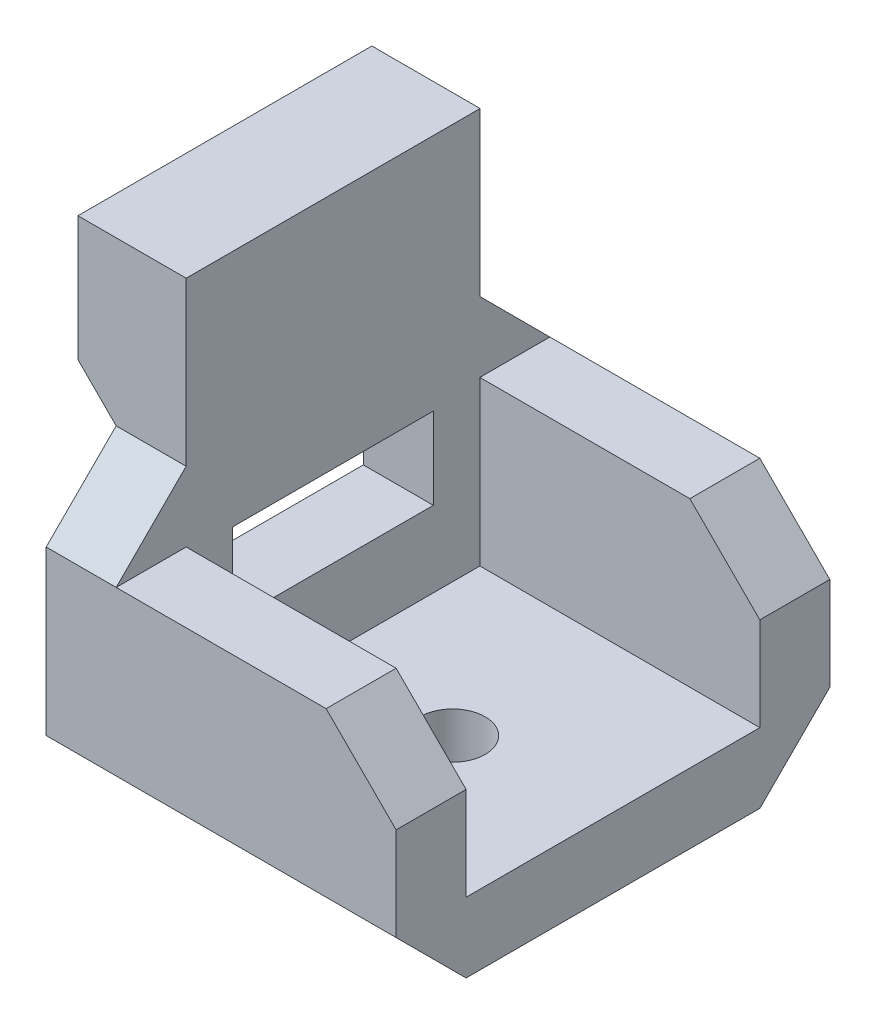
ISO-10303-21;
HEADER;
FILE_DESCRIPTION(('STEP AP214'),'2;1');
FILE_NAME('part.step','',(''),(''),'','','');
FILE_SCHEMA(('AUTOMOTIVE_DESIGN { 1 0 10303 214 1 1 1 1 }'));
ENDSEC;
DATA;
#1=APPLICATION_CONTEXT('core data for automotive mechanical design processes');
#2=APPLICATION_PROTOCOL_DEFINITION('international standard','automotive_design',2000,#1);
#3=PRODUCT_CONTEXT('',#1,'mechanical');
#4=PRODUCT('Part','Part','',(#3));
#5=PRODUCT_RELATED_PRODUCT_CATEGORY('part','',(#4));
#6=PRODUCT_DEFINITION_FORMATION('','',#4);
#7=PRODUCT_DEFINITION_CONTEXT('part definition',#1,'design');
#8=PRODUCT_DEFINITION('design','',#6,#7);
#9=PRODUCT_DEFINITION_SHAPE('','',#8);
#10=(LENGTH_UNIT() NAMED_UNIT(*) SI_UNIT(.MILLI.,.METRE.));
#11=(NAMED_UNIT(*) PLANE_ANGLE_UNIT() SI_UNIT($,.RADIAN.));
#12=(NAMED_UNIT(*) SI_UNIT($,.STERADIAN.) SOLID_ANGLE_UNIT());
#13=UNCERTAINTY_MEASURE_WITH_UNIT(LENGTH_MEASURE(1.E-05),#10,'distance_accuracy_value','');
#14=(GEOMETRIC_REPRESENTATION_CONTEXT(3) GLOBAL_UNCERTAINTY_ASSIGNED_CONTEXT((#13)) GLOBAL_UNIT_ASSIGNED_CONTEXT((#10,
#11,#12)) REPRESENTATION_CONTEXT('',''));
#15=CARTESIAN_POINT('',(0.,0.,0.));
#16=DIRECTION('',(0.,0.,1.));
#17=DIRECTION('',(1.,0.,0.));
#18=AXIS2_PLACEMENT_3D('',#15,#16,#17);
#19=CARTESIAN_POINT('',(8.54171081253427,0.,0.));
#20=DIRECTION('',(1.,0.,0.));
#21=DIRECTION('',(0.,0.,-1.));
#22=AXIS2_PLACEMENT_3D('',#19,#20,#21);
#23=PLANE('',#22);
#24=DIRECTION('',(0.,1.,0.));
#25=VECTOR('',#24,1.);
#26=CARTESIAN_POINT('',(8.54171081253427,0.,-6.295));
#27=LINE('',#26,#25);
#28=CARTESIAN_POINT('',(8.54171081253427,4.25885152872416,-6.295));
#29=VERTEX_POINT('',#28);
#30=CARTESIAN_POINT('',(8.54171081253427,11.2588508134684,-6.295));
#31=VERTEX_POINT('',#30);
#32=EDGE_CURVE('E257',#29,#31,#27,.T.);
#33=ORIENTED_EDGE('',*,*,#32,.T.);
#34=DIRECTION('',(0.,0.,-1.));
#35=VECTOR('',#34,1.);
#36=CARTESIAN_POINT('',(8.54171081253427,11.2588508134684,0.));
#37=LINE('',#36,#35);
#38=CARTESIAN_POINT('',(8.54171081253427,11.2588508134684,-9.295));
#39=VERTEX_POINT('',#38);
#40=EDGE_CURVE('E211',#31,#39,#37,.T.);
#41=ORIENTED_EDGE('',*,*,#40,.T.);
#42=DIRECTION('',(0.,0.707106781186547,0.707106781186548));
#43=VECTOR('',#42,1.);
#44=CARTESIAN_POINT('',(8.54171081253427,11.2588508134684,-9.295));
#45=LINE('',#44,#43);
#46=CARTESIAN_POINT('',(8.54171081253427,14.2569835656994,-6.30093362388452));
#47=VERTEX_POINT('',#46);
#48=EDGE_CURVE('E296',#39,#47,#45,.T.);
#49=ORIENTED_EDGE('',*,*,#48,.T.);
#50=DIRECTION('',(0.,1.,0.));
#51=VECTOR('',#50,1.);
#52=CARTESIAN_POINT('',(8.54171081253427,14.2569835656994,-6.305));
#53=LINE('',#52,#51);
#54=CARTESIAN_POINT('',(8.54171081253427,21.2369835656994,-6.305));
#55=VERTEX_POINT('',#54);
#56=EDGE_CURVE('E377',#47,#55,#53,.T.);
#57=ORIENTED_EDGE('',*,*,#56,.T.);
#58=DIRECTION('',(0.,0.,1.));
#59=VECTOR('',#58,1.);
#60=CARTESIAN_POINT('',(8.54171081253427,21.2369835656994,-6.305));
#61=LINE('',#60,#59);
#62=CARTESIAN_POINT('',(8.54171081253427,21.2369835656994,6.295));
#63=VERTEX_POINT('',#62);
#64=EDGE_CURVE('E380',#55,#63,#61,.T.);
#65=ORIENTED_EDGE('',*,*,#64,.T.);
#66=DIRECTION('',(0.,1.,0.));
#67=VECTOR('',#66,1.);
#68=CARTESIAN_POINT('',(8.54171081253427,14.2569835656994,6.295));
#69=LINE('',#68,#67);
#70=CARTESIAN_POINT('',(8.54171081253427,14.2569835656994,6.2959336238845));
#71=VERTEX_POINT('',#70);
#72=EDGE_CURVE('E388',#71,#63,#69,.T.);
#73=ORIENTED_EDGE('',*,*,#72,.F.);
#74=DIRECTION('',(0.,0.707106781186544,-0.707106781186551));
#75=VECTOR('',#74,1.);
#76=CARTESIAN_POINT('',(8.54171081253427,11.2588508134684,9.295));
#77=LINE('',#76,#75);
#78=CARTESIAN_POINT('',(8.54171081253427,11.2588508134684,9.295));
#79=VERTEX_POINT('',#78);
#80=EDGE_CURVE('E269',#79,#71,#77,.T.);
#81=ORIENTED_EDGE('',*,*,#80,.F.);
#82=DIRECTION('',(0.,0.,1.));
#83=VECTOR('',#82,1.);
#84=CARTESIAN_POINT('',(8.54171081253427,11.2588508134684,-9.295));
#85=LINE('',#84,#83);
#86=CARTESIAN_POINT('',(8.54171081253427,11.2588508134684,6.295));
#87=VERTEX_POINT('',#86);
#88=EDGE_CURVE('E216',#87,#79,#85,.T.);
#89=ORIENTED_EDGE('',*,*,#88,.F.);
#90=DIRECTION('',(0.,1.,0.));
#91=VECTOR('',#90,1.);
#92=CARTESIAN_POINT('',(8.54171081253427,11.2588508134684,6.295));
#93=LINE('',#92,#91);
#94=CARTESIAN_POINT('',(8.54171081253427,4.25885152872416,6.295));
#95=VERTEX_POINT('',#94);
#96=EDGE_CURVE('E249',#95,#87,#93,.T.);
#97=ORIENTED_EDGE('',*,*,#96,.F.);
#98=DIRECTION('',(0.,0.,-1.));
#99=VECTOR('',#98,1.);
#100=CARTESIAN_POINT('',(8.54171081253427,4.25885152872416,9.295));
#101=LINE('',#100,#99);
#102=EDGE_CURVE('E303',#95,#29,#101,.T.);
#103=ORIENTED_EDGE('',*,*,#102,.T.);
#104=EDGE_LOOP('',(#33,#41,#49,#57,#65,#73,#81,#89,#97,#103));
#105=FACE_BOUND('',#104,.T.);
#106=DIRECTION('',(0.,0.,1.));
#107=VECTOR('',#106,1.);
#108=CARTESIAN_POINT('',(8.54171081253427,11.0088515287242,-4.3));
#109=LINE('',#108,#107);
#110=CARTESIAN_POINT('',(8.54171081253427,11.0088515287242,-4.3));
#111=VERTEX_POINT('',#110);
#112=CARTESIAN_POINT('',(8.54171081253427,11.0088515287242,4.3));
#113=VERTEX_POINT('',#112);
#114=EDGE_CURVE('E372',#111,#113,#109,.T.);
#115=ORIENTED_EDGE('',*,*,#114,.F.);
#116=DIRECTION('',(0.,1.,0.));
#117=VECTOR('',#116,1.);
#118=CARTESIAN_POINT('',(8.54171081253427,7.50885152872416,-4.3));
#119=LINE('',#118,#117);
#120=CARTESIAN_POINT('',(8.54171081253427,7.50885152872416,-4.3));
#121=VERTEX_POINT('',#120);
#122=EDGE_CURVE('E359',#121,#111,#119,.T.);
#123=ORIENTED_EDGE('',*,*,#122,.F.);
#124=DIRECTION('',(0.,0.,-1.));
#125=VECTOR('',#124,1.);
#126=CARTESIAN_POINT('',(8.54171081253427,7.50885152872416,4.3));
#127=LINE('',#126,#125);
#128=CARTESIAN_POINT('',(8.54171081253427,7.50885152872416,4.3));
#129=VERTEX_POINT('',#128);
#130=EDGE_CURVE('E355',#129,#121,#127,.T.);
#131=ORIENTED_EDGE('',*,*,#130,.F.);
#132=DIRECTION('',(0.,1.,0.));
#133=VECTOR('',#132,1.);
#134=CARTESIAN_POINT('',(8.54171081253427,7.50885152872416,4.3));
#135=LINE('',#134,#133);
#136=EDGE_CURVE('E57',#129,#113,#135,.T.);
#137=ORIENTED_EDGE('',*,*,#136,.T.);
#138=EDGE_LOOP('',(#115,#123,#131,#137));
#139=FACE_BOUND('',#138,.T.);
#140=ADVANCED_FACE('F33',(#105,#139),#23,.T.);
#141=CARTESIAN_POINT('',(5.54171081253427,4.25885152872416,-9.295));
#142=DIRECTION('',(1.,0.,0.));
#143=DIRECTION('',(0.,0.,-1.));
#144=AXIS2_PLACEMENT_3D('',#141,#142,#143);
#145=PLANE('',#144);
#146=DIRECTION('',(0.,1.,0.));
#147=VECTOR('',#146,1.);
#148=CARTESIAN_POINT('',(5.54171081253427,4.25885152872416,-9.295));
#149=LINE('',#148,#147);
#150=CARTESIAN_POINT('',(5.54171081253427,4.25885152872416,-9.295));
#151=VERTEX_POINT('',#150);
#152=CARTESIAN_POINT('',(5.54171081253427,11.2588508134684,-9.295));
#153=VERTEX_POINT('',#152);
#154=EDGE_CURVE('E204',#151,#153,#149,.T.);
#155=ORIENTED_EDGE('',*,*,#154,.F.);
#156=DIRECTION('',(0.,0.,1.));
#157=VECTOR('',#156,1.);
#158=CARTESIAN_POINT('',(5.54171081253427,4.25885152872416,-9.295));
#159=LINE('',#158,#157);
#160=CARTESIAN_POINT('',(5.54171081253427,4.25885152872416,9.295));
#161=VERTEX_POINT('',#160);
#162=EDGE_CURVE('E182',#151,#161,#159,.T.);
#163=ORIENTED_EDGE('',*,*,#162,.T.);
#164=DIRECTION('',(0.,1.,0.));
#165=VECTOR('',#164,1.);
#166=CARTESIAN_POINT('',(5.54171081253427,4.25885152872416,9.295));
#167=LINE('',#166,#165);
#168=CARTESIAN_POINT('',(5.54171081253427,11.2588508134684,9.295));
#169=VERTEX_POINT('',#168);
#170=EDGE_CURVE('E241',#161,#169,#167,.T.);
#171=ORIENTED_EDGE('',*,*,#170,.T.);
#172=DIRECTION('',(0.,0.707106781186544,-0.707106781186551));
#173=VECTOR('',#172,1.);
#174=CARTESIAN_POINT('',(5.54171081253427,11.2588508134684,9.295));
#175=LINE('',#174,#173);
#176=CARTESIAN_POINT('',(5.54171081253427,14.2569835656994,6.2959336238845));
#177=VERTEX_POINT('',#176);
#178=EDGE_CURVE('E309',#169,#177,#175,.T.);
#179=ORIENTED_EDGE('',*,*,#178,.T.);
#180=DIRECTION('',(0.,0.,-1.));
#181=VECTOR('',#180,1.);
#182=CARTESIAN_POINT('',(5.54171081253427,14.2569835656994,6.29686724776901));
#183=LINE('',#182,#181);
#184=CARTESIAN_POINT('',(5.54171081253427,14.2569835656994,-6.30093362388452));
#185=VERTEX_POINT('',#184);
#186=EDGE_CURVE('E306',#177,#185,#183,.T.);
#187=ORIENTED_EDGE('',*,*,#186,.T.);
#188=DIRECTION('',(0.,0.707106781186547,0.707106781186548));
#189=VECTOR('',#188,1.);
#190=CARTESIAN_POINT('',(5.54171081253427,11.2588508134684,-9.295));
#191=LINE('',#190,#189);
#192=EDGE_CURVE('E207',#153,#185,#191,.T.);
#193=ORIENTED_EDGE('',*,*,#192,.F.);
#194=EDGE_LOOP('',(#155,#163,#171,#179,#187,#193));
#195=FACE_BOUND('',#194,.T.);
#196=DIRECTION('',(0.,1.,0.));
#197=VECTOR('',#196,1.);
#198=CARTESIAN_POINT('',(5.54171081253427,7.50885152872416,-4.3));
#199=LINE('',#198,#197);
#200=CARTESIAN_POINT('',(5.54171081253427,7.50885152872416,-4.3));
#201=VERTEX_POINT('',#200);
#202=CARTESIAN_POINT('',(5.54171081253427,11.0088515287242,-4.3));
#203=VERTEX_POINT('',#202);
#204=EDGE_CURVE('E366',#201,#203,#199,.T.);
#205=ORIENTED_EDGE('',*,*,#204,.T.);
#206=DIRECTION('',(0.,0.,1.));
#207=VECTOR('',#206,1.);
#208=CARTESIAN_POINT('',(5.54171081253427,11.0088515287242,-4.3));
#209=LINE('',#208,#207);
#210=CARTESIAN_POINT('',(5.54171081253427,11.0088515287242,4.3));
#211=VERTEX_POINT('',#210);
#212=EDGE_CURVE('E363',#203,#211,#209,.T.);
#213=ORIENTED_EDGE('',*,*,#212,.T.);
#214=DIRECTION('',(0.,1.,0.));
#215=VECTOR('',#214,1.);
#216=CARTESIAN_POINT('',(5.54171081253427,7.50885152872416,4.3));
#217=LINE('',#216,#215);
#218=CARTESIAN_POINT('',(5.54171081253427,7.50885152872416,4.3));
#219=VERTEX_POINT('',#218);
#220=EDGE_CURVE('E360',#219,#211,#217,.T.);
#221=ORIENTED_EDGE('',*,*,#220,.F.);
#222=DIRECTION('',(0.,0.,-1.));
#223=VECTOR('',#222,1.);
#224=CARTESIAN_POINT('',(5.54171081253427,7.50885152872416,4.3));
#225=LINE('',#224,#223);
#226=EDGE_CURVE('E356',#219,#201,#225,.T.);
#227=ORIENTED_EDGE('',*,*,#226,.T.);
#228=EDGE_LOOP('',(#205,#213,#221,#227));
#229=FACE_BOUND('',#228,.T.);
#230=ADVANCED_FACE('F35',(#195,#229),#145,.F.);
#231=CARTESIAN_POINT('',(5.54171081253427,11.2588508134684,-9.295));
#232=DIRECTION('',(0.,-1.,0.));
#233=DIRECTION('',(0.,0.,-1.));
#234=AXIS2_PLACEMENT_3D('',#231,#232,#233);
#235=PLANE('',#234);
#236=DIRECTION('',(1.,0.,0.));
#237=VECTOR('',#236,1.);
#238=CARTESIAN_POINT('',(5.54171140858072,11.2588508134684,6.295));
#239=LINE('',#238,#237);
#240=CARTESIAN_POINT('',(17.5417109168424,11.2588508134684,6.295));
#241=VERTEX_POINT('',#240);
#242=EDGE_CURVE('E233',#87,#241,#239,.T.);
#243=ORIENTED_EDGE('',*,*,#242,.F.);
#244=ORIENTED_EDGE('',*,*,#88,.T.);
#245=DIRECTION('',(1.,0.,0.));
#246=VECTOR('',#245,1.);
#247=CARTESIAN_POINT('',(5.54171081253427,11.2588508134684,9.295));
#248=LINE('',#247,#246);
#249=CARTESIAN_POINT('',(17.5417109168424,11.2588508134684,9.295));
#250=VERTEX_POINT('',#249);
#251=EDGE_CURVE('E240',#79,#250,#248,.T.);
#252=ORIENTED_EDGE('',*,*,#251,.T.);
#253=DIRECTION('',(0.,0.,1.));
#254=VECTOR('',#253,1.);
#255=CARTESIAN_POINT('',(17.5417109168424,11.2588508134684,-9.295));
#256=LINE('',#255,#254);
#257=EDGE_CURVE('E236',#241,#250,#256,.T.);
#258=ORIENTED_EDGE('',*,*,#257,.F.);
#259=EDGE_LOOP('',(#243,#244,#252,#258));
#260=FACE_BOUND('',#259,.T.);
#261=ADVANCED_FACE('F521',(#260),#235,.F.);
#262=CARTESIAN_POINT('',(17.5417109168424,11.2588508134684,-9.295));
#263=DIRECTION('',(-0.707106671429122,-0.707106890943956,0.));
#264=DIRECTION('',(0.707106890943956,-0.707106671429122,0.));
#265=AXIS2_PLACEMENT_3D('',#262,#263,#264);
#266=PLANE('',#265);
#267=DIRECTION('',(0.,0.,1.));
#268=VECTOR('',#267,1.);
#269=CARTESIAN_POINT('',(20.5417114085807,8.25885125305268,-9.295));
#270=LINE('',#269,#268);
#271=CARTESIAN_POINT('',(20.5417114085807,8.25885125305268,6.295));
#272=VERTEX_POINT('',#271);
#273=CARTESIAN_POINT('',(20.5417114085807,8.25885125305268,9.295));
#274=VERTEX_POINT('',#273);
#275=EDGE_CURVE('E228',#272,#274,#270,.T.);
#276=ORIENTED_EDGE('',*,*,#275,.F.);
#277=DIRECTION('',(-0.707106890943956,0.707106671429122,0.));
#278=VECTOR('',#277,1.);
#279=CARTESIAN_POINT('',(17.5417109168424,11.2588508134684,6.295));
#280=LINE('',#279,#278);
#281=EDGE_CURVE('E239',#272,#241,#280,.T.);
#282=ORIENTED_EDGE('',*,*,#281,.T.);
#283=ORIENTED_EDGE('',*,*,#257,.T.);
#284=DIRECTION('',(0.707106890943956,-0.707106671429122,0.));
#285=VECTOR('',#284,1.);
#286=CARTESIAN_POINT('',(17.5417109168424,11.2588508134684,9.295));
#287=LINE('',#286,#285);
#288=EDGE_CURVE('E229',#250,#274,#287,.T.);
#289=ORIENTED_EDGE('',*,*,#288,.T.);
#290=EDGE_LOOP('',(#276,#282,#283,#289));
#291=FACE_BOUND('',#290,.T.);
#292=ADVANCED_FACE('F517',(#291),#266,.F.);
#293=CARTESIAN_POINT('',(20.5417114085807,8.25885125305268,-9.295));
#294=DIRECTION('',(-1.,0.,0.));
#295=DIRECTION('',(0.,0.,1.));
#296=AXIS2_PLACEMENT_3D('',#293,#294,#295);
#297=PLANE('',#296);
#298=DIRECTION('',(0.,-1.,0.));
#299=VECTOR('',#298,1.);
#300=CARTESIAN_POINT('',(20.5417114085807,8.25885125305268,9.295));
#301=LINE('',#300,#299);
#302=CARTESIAN_POINT('',(20.5417114085807,4.25885152872416,9.295));
#303=VERTEX_POINT('',#302);
#304=EDGE_CURVE('E230',#274,#303,#301,.T.);
#305=ORIENTED_EDGE('',*,*,#304,.T.);
#306=DIRECTION('',(0.,-0.707106781186549,-0.707106781186546));
#307=VECTOR('',#306,1.);
#308=CARTESIAN_POINT('',(20.5417114085807,4.25885152872416,9.295));
#309=LINE('',#308,#307);
#310=CARTESIAN_POINT('',(20.5417114085807,1.2607187764932,6.29686724776904));
#311=VERTEX_POINT('',#310);
#312=EDGE_CURVE('E467',#303,#311,#309,.T.);
#313=ORIENTED_EDGE('',*,*,#312,.T.);
#314=DIRECTION('',(0.,0.,1.));
#315=VECTOR('',#314,1.);
#316=CARTESIAN_POINT('',(20.5417114085807,1.2607187764932,-6.29686724776902));
#317=LINE('',#316,#315);
#318=CARTESIAN_POINT('',(20.5417114085807,1.2607187764932,-6.29686724776902));
#319=VERTEX_POINT('',#318);
#320=EDGE_CURVE('E470',#319,#311,#317,.T.);
#321=ORIENTED_EDGE('',*,*,#320,.F.);
#322=DIRECTION('',(0.,-0.707106781186546,0.707106781186549));
#323=VECTOR('',#322,1.);
#324=CARTESIAN_POINT('',(20.5417114085807,4.25885152872416,-9.295));
#325=LINE('',#324,#323);
#326=CARTESIAN_POINT('',(20.5417114085807,4.25885152872416,-9.295));
#327=VERTEX_POINT('',#326);
#328=EDGE_CURVE('E201',#327,#319,#325,.T.);
#329=ORIENTED_EDGE('',*,*,#328,.F.);
#330=DIRECTION('',(0.,-1.,0.));
#331=VECTOR('',#330,1.);
#332=CARTESIAN_POINT('',(20.5417114085807,8.25885125305268,-9.295));
#333=LINE('',#332,#331);
#334=CARTESIAN_POINT('',(20.5417114085807,8.25885125305268,-9.295));
#335=VERTEX_POINT('',#334);
#336=EDGE_CURVE('E215',#335,#327,#333,.T.);
#337=ORIENTED_EDGE('',*,*,#336,.F.);
#338=DIRECTION('',(0.,0.,1.));
#339=VECTOR('',#338,1.);
#340=CARTESIAN_POINT('',(20.5417114085807,8.25885125305268,-9.295));
#341=LINE('',#340,#339);
#342=CARTESIAN_POINT('',(20.5417114085807,8.25885125305268,-6.295));
#343=VERTEX_POINT('',#342);
#344=EDGE_CURVE('E328',#335,#343,#341,.T.);
#345=ORIENTED_EDGE('',*,*,#344,.T.);
#346=DIRECTION('',(0.,1.,0.));
#347=VECTOR('',#346,1.);
#348=CARTESIAN_POINT('',(20.5417114085807,4.25885152872416,-6.295));
#349=LINE('',#348,#347);
#350=CARTESIAN_POINT('',(20.5417114085807,4.25885152872416,-6.295));
#351=VERTEX_POINT('',#350);
#352=EDGE_CURVE('E342',#351,#343,#349,.T.);
#353=ORIENTED_EDGE('',*,*,#352,.F.);
#354=DIRECTION('',(0.,0.,-1.));
#355=VECTOR('',#354,1.);
#356=CARTESIAN_POINT('',(20.5417114085807,4.25885152872416,9.295));
#357=LINE('',#356,#355);
#358=CARTESIAN_POINT('',(20.5417114085807,4.25885152872416,6.295));
#359=VERTEX_POINT('',#358);
#360=EDGE_CURVE('E464',#359,#351,#357,.T.);
#361=ORIENTED_EDGE('',*,*,#360,.F.);
#362=DIRECTION('',(0.,1.,0.));
#363=VECTOR('',#362,1.);
#364=CARTESIAN_POINT('',(20.5417114085807,8.25885125305268,6.295));
#365=LINE('',#364,#363);
#366=EDGE_CURVE('E225',#359,#272,#365,.T.);
#367=ORIENTED_EDGE('',*,*,#366,.T.);
#368=ORIENTED_EDGE('',*,*,#275,.T.);
#369=EDGE_LOOP('',(#305,#313,#321,#329,#337,#345,#353,#361,#367,#368));
#370=FACE_BOUND('',#369,.T.);
#371=ADVANCED_FACE('F513',(#370),#297,.F.);
#372=CARTESIAN_POINT('',(0.,0.,9.295));
#373=DIRECTION('',(0.,0.,-1.));
#374=DIRECTION('',(-1.,0.,0.));
#375=AXIS2_PLACEMENT_3D('',#372,#373,#374);
#376=PLANE('',#375);
#377=ORIENTED_EDGE('',*,*,#251,.F.);
#378=EDGE_CURVE('E237',#169,#79,#248,.T.);
#379=ORIENTED_EDGE('',*,*,#378,.F.);
#380=ORIENTED_EDGE('',*,*,#170,.F.);
#381=DIRECTION('',(-1.,0.,0.));
#382=VECTOR('',#381,1.);
#383=CARTESIAN_POINT('',(20.5417114085807,4.25885152872416,9.295));
#384=LINE('',#383,#382);
#385=EDGE_CURVE('E243',#303,#161,#384,.T.);
#386=ORIENTED_EDGE('',*,*,#385,.F.);
#387=ORIENTED_EDGE('',*,*,#304,.F.);
#388=ORIENTED_EDGE('',*,*,#288,.F.);
#389=EDGE_LOOP('',(#377,#379,#380,#386,#387,#388));
#390=FACE_BOUND('',#389,.T.);
#391=ADVANCED_FACE('F510',(#390),#376,.F.);
#392=CARTESIAN_POINT('',(5.54171140858072,11.2588508134684,6.295));
#393=DIRECTION('',(0.,0.,1.));
#394=DIRECTION('',(0.,-1.,0.));
#395=AXIS2_PLACEMENT_3D('',#392,#393,#394);
#396=PLANE('',#395);
#397=DIRECTION('',(1.,0.,0.));
#398=VECTOR('',#397,1.);
#399=CARTESIAN_POINT('',(5.54171140858072,4.25885152872416,6.295));
#400=LINE('',#399,#398);
#401=EDGE_CURVE('E220',#95,#359,#400,.T.);
#402=ORIENTED_EDGE('',*,*,#401,.F.);
#403=ORIENTED_EDGE('',*,*,#96,.T.);
#404=ORIENTED_EDGE('',*,*,#242,.T.);
#405=ORIENTED_EDGE('',*,*,#281,.F.);
#406=ORIENTED_EDGE('',*,*,#366,.F.);
#407=EDGE_LOOP('',(#402,#403,#404,#405,#406));
#408=FACE_BOUND('',#407,.T.);
#409=ADVANCED_FACE('F524',(#408),#396,.F.);
#410=CARTESIAN_POINT('',(8.54171081253427,4.25885152872416,-9.295));
#411=DIRECTION('',(0.,0.,1.));
#412=DIRECTION('',(1.,0.,0.));
#413=AXIS2_PLACEMENT_3D('',#410,#411,#412);
#414=PLANE('',#413);
#415=ORIENTED_EDGE('',*,*,#154,.T.);
#416=DIRECTION('',(-1.,0.,0.));
#417=VECTOR('',#416,1.);
#418=CARTESIAN_POINT('',(8.54171081253427,11.2588508134684,-9.295));
#419=LINE('',#418,#417);
#420=EDGE_CURVE('E217',#39,#153,#419,.T.);
#421=ORIENTED_EDGE('',*,*,#420,.F.);
#422=DIRECTION('',(1.,0.,0.));
#423=VECTOR('',#422,1.);
#424=CARTESIAN_POINT('',(5.54171081253427,11.2588508134684,-9.295));
#425=LINE('',#424,#423);
#426=CARTESIAN_POINT('',(17.5417109168424,11.2588508134684,-9.295));
#427=VERTEX_POINT('',#426);
#428=EDGE_CURVE('E334',#39,#427,#425,.T.);
#429=ORIENTED_EDGE('',*,*,#428,.T.);
#430=DIRECTION('',(0.707106890943956,-0.707106671429122,0.));
#431=VECTOR('',#430,1.);
#432=CARTESIAN_POINT('',(17.5417109168424,11.2588508134684,-9.295));
#433=LINE('',#432,#431);
#434=EDGE_CURVE('E332',#427,#335,#433,.T.);
#435=ORIENTED_EDGE('',*,*,#434,.T.);
#436=ORIENTED_EDGE('',*,*,#336,.T.);
#437=DIRECTION('',(-1.,0.,0.));
#438=VECTOR('',#437,1.);
#439=CARTESIAN_POINT('',(8.54171081253427,4.25885152872416,-9.295));
#440=LINE('',#439,#438);
#441=EDGE_CURVE('E198',#327,#151,#440,.T.);
#442=ORIENTED_EDGE('',*,*,#441,.T.);
#443=EDGE_LOOP('',(#415,#421,#429,#435,#436,#442));
#444=FACE_BOUND('',#443,.T.);
#445=ADVANCED_FACE('F213',(#444),#414,.F.);
#446=CARTESIAN_POINT('',(8.54171081253427,11.2588508134684,-9.295));
#447=DIRECTION('',(0.,-0.707106781186548,0.707106781186547));
#448=DIRECTION('',(0.,-0.707106781186547,-0.707106781186548));
#449=AXIS2_PLACEMENT_3D('',#446,#447,#448);
#450=PLANE('',#449);
#451=ORIENTED_EDGE('',*,*,#192,.T.);
#452=CARTESIAN_POINT('',(8.54171081253427,14.2569835656994,-6.305));
#453=DIRECTION('',(-1.,0.,0.));
#454=VECTOR('',#453,1.);
#455=LINE('',#452,#454);
#456=EDGE_CURVE('E222',#47,#185,#455,.T.);
#457=ORIENTED_EDGE('',*,*,#456,.F.);
#458=ORIENTED_EDGE('',*,*,#48,.F.);
#459=ORIENTED_EDGE('',*,*,#420,.T.);
#460=EDGE_LOOP('',(#451,#457,#458,#459));
#461=FACE_BOUND('',#460,.T.);
#462=ADVANCED_FACE('F282',(#461),#450,.F.);
#463=CARTESIAN_POINT('',(8.54171081253427,11.2588508134684,9.295));
#464=DIRECTION('',(0.,0.707106781186551,0.707106781186544));
#465=DIRECTION('',(0.,-0.707106781186544,0.707106781186551));
#466=AXIS2_PLACEMENT_3D('',#463,#464,#465);
#467=PLANE('',#466);
#468=ORIENTED_EDGE('',*,*,#178,.F.);
#469=ORIENTED_EDGE('',*,*,#378,.T.);
#470=ORIENTED_EDGE('',*,*,#80,.T.);
#471=CARTESIAN_POINT('',(8.54171081253427,14.2569835656994,6.29686724776901));
#472=DIRECTION('',(-1.,0.,0.));
#473=VECTOR('',#472,1.);
#474=LINE('',#471,#473);
#475=EDGE_CURVE('E263',#71,#177,#474,.T.);
#476=ORIENTED_EDGE('',*,*,#475,.T.);
#477=EDGE_LOOP('',(#468,#469,#470,#476));
#478=FACE_BOUND('',#477,.T.);
#479=ADVANCED_FACE('F271',(#478),#467,.T.);
#480=CARTESIAN_POINT('',(17.5417109168424,11.2588508134684,-9.295));
#481=DIRECTION('',(-0.707106671429122,-0.707106890943956,0.));
#482=DIRECTION('',(0.707106890943956,-0.707106671429122,0.));
#483=AXIS2_PLACEMENT_3D('',#480,#481,#482);
#484=PLANE('',#483);
#485=DIRECTION('',(0.,0.,1.));
#486=VECTOR('',#485,1.);
#487=CARTESIAN_POINT('',(17.5417109168424,11.2588508134684,-9.295));
#488=LINE('',#487,#486);
#489=CARTESIAN_POINT('',(17.5417109168424,11.2588508134684,-6.295));
#490=VERTEX_POINT('',#489);
#491=EDGE_CURVE('E325',#427,#490,#488,.T.);
#492=ORIENTED_EDGE('',*,*,#491,.T.);
#493=DIRECTION('',(0.707106890943956,-0.707106671429122,0.));
#494=VECTOR('',#493,1.);
#495=CARTESIAN_POINT('',(17.5417109168424,11.2588508134684,-6.295));
#496=LINE('',#495,#494);
#497=EDGE_CURVE('E336',#490,#343,#496,.T.);
#498=ORIENTED_EDGE('',*,*,#497,.T.);
#499=ORIENTED_EDGE('',*,*,#344,.F.);
#500=ORIENTED_EDGE('',*,*,#434,.F.);
#501=EDGE_LOOP('',(#492,#498,#499,#500));
#502=FACE_BOUND('',#501,.T.);
#503=ADVANCED_FACE('F281',(#502),#484,.F.);
#504=CARTESIAN_POINT('',(5.54171081253427,11.2588508134684,-9.295));
#505=DIRECTION('',(0.,-1.,0.));
#506=DIRECTION('',(0.,0.,-1.));
#507=AXIS2_PLACEMENT_3D('',#504,#505,#506);
#508=PLANE('',#507);
#509=ORIENTED_EDGE('',*,*,#40,.F.);
#510=DIRECTION('',(1.,0.,0.));
#511=VECTOR('',#510,1.);
#512=CARTESIAN_POINT('',(5.54171140858072,11.2588508134684,-6.295));
#513=LINE('',#512,#511);
#514=EDGE_CURVE('E339',#31,#490,#513,.T.);
#515=ORIENTED_EDGE('',*,*,#514,.T.);
#516=ORIENTED_EDGE('',*,*,#491,.F.);
#517=ORIENTED_EDGE('',*,*,#428,.F.);
#518=EDGE_LOOP('',(#509,#515,#516,#517));
#519=FACE_BOUND('',#518,.T.);
#520=ADVANCED_FACE('F537',(#519),#508,.F.);
#521=CARTESIAN_POINT('',(5.54171140858072,4.25885152872416,-6.295));
#522=DIRECTION('',(0.,0.,-1.));
#523=DIRECTION('',(-1.,0.,0.));
#524=AXIS2_PLACEMENT_3D('',#521,#522,#523);
#525=PLANE('',#524);
#526=ORIENTED_EDGE('',*,*,#32,.F.);
#527=DIRECTION('',(1.,0.,0.));
#528=VECTOR('',#527,1.);
#529=CARTESIAN_POINT('',(5.54171140858072,4.25885152872416,-6.295));
#530=LINE('',#529,#528);
#531=EDGE_CURVE('E340',#29,#351,#530,.T.);
#532=ORIENTED_EDGE('',*,*,#531,.T.);
#533=ORIENTED_EDGE('',*,*,#352,.T.);
#534=ORIENTED_EDGE('',*,*,#497,.F.);
#535=ORIENTED_EDGE('',*,*,#514,.F.);
#536=EDGE_LOOP('',(#526,#532,#533,#534,#535));
#537=FACE_BOUND('',#536,.T.);
#538=ADVANCED_FACE('F529',(#537),#525,.F.);
#539=CARTESIAN_POINT('',(8.54171081253427,7.50885152872416,-4.3));
#540=DIRECTION('',(0.,0.,1.));
#541=DIRECTION('',(1.,0.,0.));
#542=AXIS2_PLACEMENT_3D('',#539,#540,#541);
#543=PLANE('',#542);
#544=ORIENTED_EDGE('',*,*,#204,.F.);
#545=DIRECTION('',(-1.,0.,0.));
#546=VECTOR('',#545,1.);
#547=CARTESIAN_POINT('',(8.54171081253427,7.50885152872416,-4.3));
#548=LINE('',#547,#546);
#549=EDGE_CURVE('E352',#121,#201,#548,.T.);
#550=ORIENTED_EDGE('',*,*,#549,.F.);
#551=ORIENTED_EDGE('',*,*,#122,.T.);
#552=DIRECTION('',(-1.,0.,0.));
#553=VECTOR('',#552,1.);
#554=CARTESIAN_POINT('',(8.54171081253427,11.0088515287242,-4.3));
#555=LINE('',#554,#553);
#556=EDGE_CURVE('E345',#111,#203,#555,.T.);
#557=ORIENTED_EDGE('',*,*,#556,.T.);
#558=EDGE_LOOP('',(#544,#550,#551,#557));
#559=FACE_BOUND('',#558,.T.);
#560=ADVANCED_FACE('F544',(#559),#543,.T.);
#561=CARTESIAN_POINT('',(8.54171081253427,11.0088515287242,-4.3));
#562=DIRECTION('',(0.,-1.,0.));
#563=DIRECTION('',(0.,0.,-1.));
#564=AXIS2_PLACEMENT_3D('',#561,#562,#563);
#565=PLANE('',#564);
#566=ORIENTED_EDGE('',*,*,#212,.F.);
#567=ORIENTED_EDGE('',*,*,#556,.F.);
#568=ORIENTED_EDGE('',*,*,#114,.T.);
#569=DIRECTION('',(-1.,0.,0.));
#570=VECTOR('',#569,1.);
#571=CARTESIAN_POINT('',(8.54171081253427,11.0088515287242,4.3));
#572=LINE('',#571,#570);
#573=EDGE_CURVE('E348',#113,#211,#572,.T.);
#574=ORIENTED_EDGE('',*,*,#573,.T.);
#575=EDGE_LOOP('',(#566,#567,#568,#574));
#576=FACE_BOUND('',#575,.T.);
#577=ADVANCED_FACE('F609',(#576),#565,.T.);
#578=CARTESIAN_POINT('',(8.54171081253427,7.50885152872416,4.3));
#579=DIRECTION('',(0.,0.,1.));
#580=DIRECTION('',(1.,0.,0.));
#581=AXIS2_PLACEMENT_3D('',#578,#579,#580);
#582=PLANE('',#581);
#583=ORIENTED_EDGE('',*,*,#220,.T.);
#584=ORIENTED_EDGE('',*,*,#573,.F.);
#585=ORIENTED_EDGE('',*,*,#136,.F.);
#586=DIRECTION('',(-1.,0.,0.));
#587=VECTOR('',#586,1.);
#588=CARTESIAN_POINT('',(8.54171081253427,7.50885152872416,4.3));
#589=LINE('',#588,#587);
#590=EDGE_CURVE('E350',#129,#219,#589,.T.);
#591=ORIENTED_EDGE('',*,*,#590,.T.);
#592=EDGE_LOOP('',(#583,#584,#585,#591));
#593=FACE_BOUND('',#592,.T.);
#594=ADVANCED_FACE('F620',(#593),#582,.F.);
#595=CARTESIAN_POINT('',(8.54171081253427,7.50885152872416,4.3));
#596=DIRECTION('',(0.,1.,0.));
#597=DIRECTION('',(0.,0.,1.));
#598=AXIS2_PLACEMENT_3D('',#595,#596,#597);
#599=PLANE('',#598);
#600=ORIENTED_EDGE('',*,*,#226,.F.);
#601=ORIENTED_EDGE('',*,*,#590,.F.);
#602=ORIENTED_EDGE('',*,*,#130,.T.);
#603=ORIENTED_EDGE('',*,*,#549,.T.);
#604=EDGE_LOOP('',(#600,#601,#602,#603));
#605=FACE_BOUND('',#604,.T.);
#606=ADVANCED_FACE('F629',(#605),#599,.T.);
#607=CARTESIAN_POINT('',(5.54171081253427,14.2569835656994,-6.305));
#608=DIRECTION('',(0.707106781186548,0.707106781186548,0.));
#609=DIRECTION('',(-0.707106781186548,0.707106781186548,0.));
#610=AXIS2_PLACEMENT_3D('',#607,#608,#609);
#611=PLANE('',#610);
#612=DIRECTION('',(-0.707106781186547,0.707106781186547,0.));
#613=VECTOR('',#612,1.);
#614=CARTESIAN_POINT('',(5.54171081253427,14.2569835656994,6.295));
#615=LINE('',#614,#613);
#616=CARTESIAN_POINT('',(3.90829414799334,15.8904002302403,6.295));
#617=VERTEX_POINT('',#616);
#618=EDGE_CURVE('E420',#177,#617,#615,.T.);
#619=ORIENTED_EDGE('',*,*,#618,.T.);
#620=DIRECTION('',(0.,0.,1.));
#621=VECTOR('',#620,1.);
#622=CARTESIAN_POINT('',(3.90829414799334,15.8904002302403,-6.305));
#623=LINE('',#622,#621);
#624=CARTESIAN_POINT('',(3.90829414799334,15.8904002302403,-6.305));
#625=VERTEX_POINT('',#624);
#626=EDGE_CURVE('E369',#625,#617,#623,.T.);
#627=ORIENTED_EDGE('',*,*,#626,.F.);
#628=DIRECTION('',(-0.707106781186547,0.707106781186547,0.));
#629=VECTOR('',#628,1.);
#630=CARTESIAN_POINT('',(5.54171081253427,14.2569835656994,-6.305));
#631=LINE('',#630,#629);
#632=EDGE_CURVE('E384',#185,#625,#631,.T.);
#633=ORIENTED_EDGE('',*,*,#632,.F.);
#634=ORIENTED_EDGE('',*,*,#186,.F.);
#635=EDGE_LOOP('',(#619,#627,#633,#634));
#636=FACE_BOUND('',#635,.T.);
#637=ADVANCED_FACE('F451',(#636),#611,.F.);
#638=CARTESIAN_POINT('',(3.90829414799334,15.8904002302403,-6.305));
#639=DIRECTION('',(0.999999241930889,0.00123131541311474,0.));
#640=DIRECTION('',(-0.00123131541311474,0.99999924193089,0.));
#641=AXIS2_PLACEMENT_3D('',#638,#639,#640);
#642=PLANE('',#641);
#643=DIRECTION('',(-0.00123131541311474,0.99999924193089,0.));
#644=VECTOR('',#643,1.);
#645=CARTESIAN_POINT('',(3.90829414799334,15.8904002302403,6.295));
#646=LINE('',#645,#644);
#647=CARTESIAN_POINT('',(3.90171081253427,21.2369835656994,6.295));
#648=VERTEX_POINT('',#647);
#649=EDGE_CURVE('E428',#617,#648,#646,.T.);
#650=ORIENTED_EDGE('',*,*,#649,.T.);
#651=DIRECTION('',(0.,0.,1.));
#652=VECTOR('',#651,1.);
#653=CARTESIAN_POINT('',(3.90171081253427,21.2369835656994,-6.305));
#654=LINE('',#653,#652);
#655=CARTESIAN_POINT('',(3.90171081253427,21.2369835656994,-6.305));
#656=VERTEX_POINT('',#655);
#657=EDGE_CURVE('E443',#656,#648,#654,.T.);
#658=ORIENTED_EDGE('',*,*,#657,.F.);
#659=DIRECTION('',(-0.00123131541311474,0.99999924193089,0.));
#660=VECTOR('',#659,1.);
#661=CARTESIAN_POINT('',(3.90829414799334,15.8904002302403,-6.305));
#662=LINE('',#661,#660);
#663=EDGE_CURVE('E387',#625,#656,#662,.T.);
#664=ORIENTED_EDGE('',*,*,#663,.F.);
#665=ORIENTED_EDGE('',*,*,#626,.T.);
#666=EDGE_LOOP('',(#650,#658,#664,#665));
#667=FACE_BOUND('',#666,.T.);
#668=ADVANCED_FACE('F447',(#667),#642,.F.);
#669=CARTESIAN_POINT('',(8.54171081253427,21.2369835656994,-6.305));
#670=DIRECTION('',(0.,1.,0.));
#671=DIRECTION('',(0.,0.,1.));
#672=AXIS2_PLACEMENT_3D('',#669,#670,#671);
#673=PLANE('',#672);
#674=DIRECTION('',(-1.,0.,0.));
#675=VECTOR('',#674,1.);
#676=CARTESIAN_POINT('',(8.54171081253427,21.2369835656994,6.295));
#677=LINE('',#676,#675);
#678=EDGE_CURVE('E432',#63,#648,#677,.T.);
#679=ORIENTED_EDGE('',*,*,#678,.F.);
#680=ORIENTED_EDGE('',*,*,#64,.F.);
#681=DIRECTION('',(-1.,0.,0.));
#682=VECTOR('',#681,1.);
#683=CARTESIAN_POINT('',(8.54171081253427,21.2369835656994,-6.305));
#684=LINE('',#683,#682);
#685=EDGE_CURVE('E381',#55,#656,#684,.T.);
#686=ORIENTED_EDGE('',*,*,#685,.T.);
#687=ORIENTED_EDGE('',*,*,#657,.T.);
#688=EDGE_LOOP('',(#679,#680,#686,#687));
#689=FACE_BOUND('',#688,.T.);
#690=ADVANCED_FACE('F406',(#689),#673,.T.);
#691=CARTESIAN_POINT('',(0.,0.,-6.305));
#692=DIRECTION('',(0.,0.,1.));
#693=DIRECTION('',(1.,0.,0.));
#694=AXIS2_PLACEMENT_3D('',#691,#692,#693);
#695=PLANE('',#694);
#696=ORIENTED_EDGE('',*,*,#632,.T.);
#697=ORIENTED_EDGE('',*,*,#663,.T.);
#698=ORIENTED_EDGE('',*,*,#685,.F.);
#699=ORIENTED_EDGE('',*,*,#56,.F.);
#700=ORIENTED_EDGE('',*,*,#456,.T.);
#701=EDGE_LOOP('',(#696,#697,#698,#699,#700));
#702=FACE_BOUND('',#701,.T.);
#703=ADVANCED_FACE('F395',(#702),#695,.F.);
#704=CARTESIAN_POINT('',(0.,0.,6.295));
#705=DIRECTION('',(0.,0.,1.));
#706=DIRECTION('',(1.,0.,0.));
#707=AXIS2_PLACEMENT_3D('',#704,#705,#706);
#708=PLANE('',#707);
#709=ORIENTED_EDGE('',*,*,#618,.F.);
#710=ORIENTED_EDGE('',*,*,#475,.F.);
#711=ORIENTED_EDGE('',*,*,#72,.T.);
#712=ORIENTED_EDGE('',*,*,#678,.T.);
#713=ORIENTED_EDGE('',*,*,#649,.F.);
#714=EDGE_LOOP('',(#709,#710,#711,#712,#713));
#715=FACE_BOUND('',#714,.T.);
#716=ADVANCED_FACE('F405',(#715),#708,.T.);
#717=CARTESIAN_POINT('',(5.54171140858072,4.25885152872416,-9.295));
#718=DIRECTION('',(0.,0.707106781186549,0.707106781186546));
#719=DIRECTION('',(0.,-0.707106781186546,0.707106781186549));
#720=AXIS2_PLACEMENT_3D('',#717,#718,#719);
#721=PLANE('',#720);
#722=DIRECTION('',(1.,0.,0.));
#723=VECTOR('',#722,1.);
#724=CARTESIAN_POINT('',(5.54171140858072,1.2607187764932,-6.29686724776902));
#725=LINE('',#724,#723);
#726=CARTESIAN_POINT('',(8.54171140858072,1.2607187764932,-6.29686724776902));
#727=VERTEX_POINT('',#726);
#728=EDGE_CURVE('E200',#727,#319,#725,.T.);
#729=ORIENTED_EDGE('',*,*,#728,.F.);
#730=DIRECTION('',(-0.577589988228632,0.577230372337616,-0.577230372337618));
#731=VECTOR('',#730,1.);
#732=CARTESIAN_POINT('',(5.54171101138144,4.2588513300008,-9.29499980127663));
#733=LINE('',#732,#731);
#734=EDGE_CURVE('E185',#727,#151,#733,.T.);
#735=ORIENTED_EDGE('',*,*,#734,.T.);
#736=ORIENTED_EDGE('',*,*,#441,.F.);
#737=ORIENTED_EDGE('',*,*,#328,.T.);
#738=EDGE_LOOP('',(#729,#735,#736,#737));
#739=FACE_BOUND('',#738,.T.);
#740=ADVANCED_FACE('F195',(#739),#721,.F.);
#741=CARTESIAN_POINT('',(5.54171140858072,1.2607187764932,-6.29686724776902));
#742=DIRECTION('',(0.,1.,0.));
#743=DIRECTION('',(0.,0.,1.));
#744=AXIS2_PLACEMENT_3D('',#741,#742,#743);
#745=PLANE('',#744);
#746=CARTESIAN_POINT('',(14.2517114085807,1.2607187764932,0.586867247769044));
#747=DIRECTION('',(0.,-1.,0.));
#748=DIRECTION('',(0.,0.,-1.));
#749=AXIS2_PLACEMENT_3D('',#746,#747,#748);
#750=CIRCLE('',#749,3.);
#751=CARTESIAN_POINT('',(14.2517114085807,1.2607187764932,-2.41313275223096));
#752=VERTEX_POINT('',#751);
#753=EDGE_CURVE('E11',#752,#752,#750,.T.);
#754=ORIENTED_EDGE('',*,*,#753,.F.);
#755=EDGE_LOOP('',(#754));
#756=FACE_BOUND('',#755,.T.);
#757=DIRECTION('',(1.,0.,0.));
#758=VECTOR('',#757,1.);
#759=CARTESIAN_POINT('',(5.54171140858072,1.2607187764932,6.29686724776904));
#760=LINE('',#759,#758);
#761=CARTESIAN_POINT('',(8.54171140858072,1.2607187764932,6.29686724776904));
#762=VERTEX_POINT('',#761);
#763=EDGE_CURVE('E462',#762,#311,#760,.T.);
#764=ORIENTED_EDGE('',*,*,#763,.F.);
#765=DIRECTION('',(0.,0.,1.));
#766=VECTOR('',#765,1.);
#767=CARTESIAN_POINT('',(8.54171140858072,1.2607187764932,-9.295));
#768=LINE('',#767,#766);
#769=EDGE_CURVE('E49',#727,#762,#768,.T.);
#770=ORIENTED_EDGE('',*,*,#769,.F.);
#771=ORIENTED_EDGE('',*,*,#728,.T.);
#772=ORIENTED_EDGE('',*,*,#320,.T.);
#773=EDGE_LOOP('',(#764,#770,#771,#772));
#774=FACE_BOUND('',#773,.T.);
#775=ADVANCED_FACE('F499',(#756,#774),#745,.F.);
#776=CARTESIAN_POINT('',(5.54171140858072,4.25885152872416,9.295));
#777=DIRECTION('',(0.,-0.707106781186546,0.707106781186549));
#778=DIRECTION('',(0.,-0.707106781186549,-0.707106781186546));
#779=AXIS2_PLACEMENT_3D('',#776,#777,#778);
#780=PLANE('',#779);
#781=DIRECTION('',(-0.577589988228634,0.577230372337618,0.577230372337616));
#782=VECTOR('',#781,1.);
#783=CARTESIAN_POINT('',(5.54171101138144,4.2588513300008,9.29499980127663));
#784=LINE('',#783,#782);
#785=EDGE_CURVE('E37',#762,#161,#784,.T.);
#786=ORIENTED_EDGE('',*,*,#785,.F.);
#787=ORIENTED_EDGE('',*,*,#763,.T.);
#788=ORIENTED_EDGE('',*,*,#312,.F.);
#789=ORIENTED_EDGE('',*,*,#385,.T.);
#790=EDGE_LOOP('',(#786,#787,#788,#789));
#791=FACE_BOUND('',#790,.T.);
#792=ADVANCED_FACE('F502',(#791),#780,.T.);
#793=CARTESIAN_POINT('',(5.54171140858072,4.25885152872416,9.295));
#794=DIRECTION('',(0.,-1.,0.));
#795=DIRECTION('',(0.,0.,-1.));
#796=AXIS2_PLACEMENT_3D('',#793,#794,#795);
#797=PLANE('',#796);
#798=CARTESIAN_POINT('',(14.2517114085807,4.25885152872416,0.586867247769044));
#799=DIRECTION('',(0.,-1.,0.));
#800=DIRECTION('',(0.,0.,-1.));
#801=AXIS2_PLACEMENT_3D('',#798,#799,#800);
#802=CIRCLE('',#801,1.4);
#803=CARTESIAN_POINT('',(14.2517114085807,4.25885152872416,-0.813132752230956));
#804=VERTEX_POINT('',#803);
#805=EDGE_CURVE('E477',#804,#804,#802,.T.);
#806=ORIENTED_EDGE('',*,*,#805,.T.);
#807=EDGE_LOOP('',(#806));
#808=FACE_BOUND('',#807,.T.);
#809=ORIENTED_EDGE('',*,*,#531,.F.);
#810=ORIENTED_EDGE('',*,*,#102,.F.);
#811=ORIENTED_EDGE('',*,*,#401,.T.);
#812=ORIENTED_EDGE('',*,*,#360,.T.);
#813=EDGE_LOOP('',(#809,#810,#811,#812));
#814=FACE_BOUND('',#813,.T.);
#815=ADVANCED_FACE('F526',(#808,#814),#797,.F.);
#816=CARTESIAN_POINT('',(8.54171140858072,1.2607187764932,-9.295));
#817=DIRECTION('',(0.706886550902683,0.707326942900458,0.));
#818=DIRECTION('',(-0.707326942900458,0.706886550902683,0.));
#819=AXIS2_PLACEMENT_3D('',#816,#817,#818);
#820=PLANE('',#819);
#821=ORIENTED_EDGE('',*,*,#769,.T.);
#822=ORIENTED_EDGE('',*,*,#785,.T.);
#823=ORIENTED_EDGE('',*,*,#162,.F.);
#824=ORIENTED_EDGE('',*,*,#734,.F.);
#825=EDGE_LOOP('',(#821,#822,#823,#824));
#826=FACE_BOUND('',#825,.T.);
#827=ADVANCED_FACE('F184',(#826),#820,.F.);
#828=CARTESIAN_POINT('',(14.2517114085807,-0.0392812235068024,0.586867247769044));
#829=DIRECTION('',(0.,1.,0.));
#830=DIRECTION('',(0.,0.,1.));
#831=AXIS2_PLACEMENT_3D('',#828,#829,#830);
#832=CYLINDRICAL_SURFACE('',#831,3.);
#833=CARTESIAN_POINT('',(14.2517114085807,-0.0392812235068024,0.586867247769044));
#834=DIRECTION('',(0.,-1.,0.));
#835=DIRECTION('',(0.,0.,-1.));
#836=AXIS2_PLACEMENT_3D('',#833,#834,#835);
#837=CIRCLE('',#836,3.);
#838=CARTESIAN_POINT('',(14.2517114085807,-0.0392812235068024,-2.41313275223096));
#839=VERTEX_POINT('',#838);
#840=EDGE_CURVE('E190',#839,#839,#837,.T.);
#841=ORIENTED_EDGE('',*,*,#840,.F.);
#842=EDGE_LOOP('',(#841));
#843=FACE_BOUND('',#842,.T.);
#844=ORIENTED_EDGE('',*,*,#753,.T.);
#845=EDGE_LOOP('',(#844));
#846=FACE_BOUND('',#845,.T.);
#847=ADVANCED_FACE('F490',(#843,#846),#832,.T.);
#848=CARTESIAN_POINT('',(14.2517114085807,-0.0392812235068024,0.586867247769044));
#849=DIRECTION('',(0.,-1.,0.));
#850=DIRECTION('',(0.,0.,-1.));
#851=AXIS2_PLACEMENT_3D('',#848,#849,#850);
#852=PLANE('',#851);
#853=CARTESIAN_POINT('',(14.2517114085807,-0.0392812235068024,0.586867247769044));
#854=DIRECTION('',(0.,-1.,0.));
#855=DIRECTION('',(0.,0.,-1.));
#856=AXIS2_PLACEMENT_3D('',#853,#854,#855);
#857=CIRCLE('',#856,1.4);
#858=CARTESIAN_POINT('',(14.2517114085807,-0.0392812235068029,-0.813132752230956));
#859=VERTEX_POINT('',#858);
#860=EDGE_CURVE('E480',#859,#859,#857,.T.);
#861=ORIENTED_EDGE('',*,*,#860,.F.);
#862=EDGE_LOOP('',(#861));
#863=FACE_BOUND('',#862,.T.);
#864=ORIENTED_EDGE('',*,*,#840,.T.);
#865=EDGE_LOOP('',(#864));
#866=FACE_BOUND('',#865,.T.);
#867=ADVANCED_FACE('F487',(#863,#866),#852,.T.);
#868=CARTESIAN_POINT('',(14.2517114085807,4.2607187764932,0.586867247769044));
#869=DIRECTION('',(0.,-1.,0.));
#870=DIRECTION('',(0.,0.,-1.));
#871=AXIS2_PLACEMENT_3D('',#868,#869,#870);
#872=CYLINDRICAL_SURFACE('',#871,1.4);
#873=CARTESIAN_POINT('',(14.2517114085807,-0.0392812235068029,-0.813132752230956));
#874=CARTESIAN_POINT('',(14.2517114085807,0.00549099266226955,-0.813132752230956));
#875=CARTESIAN_POINT('',(14.2517114085807,0.050263208831342,-0.813132752230956));
#876=CARTESIAN_POINT('',(14.2517114085807,0.139807641169487,-0.813132752230956));
#877=CARTESIAN_POINT('',(14.2517114085807,0.18457985733856,-0.813132752230956));
#878=CARTESIAN_POINT('',(14.2517114085807,0.274124289676705,-0.813132752230956));
#879=CARTESIAN_POINT('',(14.2517114085807,0.318896505845778,-0.813132752230956));
#880=CARTESIAN_POINT('',(14.2517114085807,0.408440938183923,-0.813132752230956));
#881=CARTESIAN_POINT('',(14.2517114085807,0.453213154352995,-0.813132752230956));
#882=CARTESIAN_POINT('',(14.2517114085807,0.54275758669114,-0.813132752230956));
#883=CARTESIAN_POINT('',(14.2517114085807,0.587529802860213,-0.813132752230956));
#884=CARTESIAN_POINT('',(14.2517114085807,0.677074235198358,-0.813132752230956));
#885=CARTESIAN_POINT('',(14.2517114085807,0.721846451367431,-0.813132752230956));
#886=CARTESIAN_POINT('',(14.2517114085807,0.811390883705576,-0.813132752230956));
#887=CARTESIAN_POINT('',(14.2517114085807,0.856163099874648,-0.813132752230956));
#888=CARTESIAN_POINT('',(14.2517114085807,0.945707532212794,-0.813132752230956));
#889=CARTESIAN_POINT('',(14.2517114085807,0.990479748381866,-0.813132752230956));
#890=CARTESIAN_POINT('',(14.2517114085807,1.08002418072001,-0.813132752230956));
#891=CARTESIAN_POINT('',(14.2517114085807,1.12479639688908,-0.813132752230956));
#892=CARTESIAN_POINT('',(14.2517114085807,1.21434082922723,-0.813132752230956));
#893=CARTESIAN_POINT('',(14.2517114085807,1.2591130453963,-0.813132752230956));
#894=CARTESIAN_POINT('',(14.2517114085807,1.34865747773445,-0.813132752230956));
#895=CARTESIAN_POINT('',(14.2517114085807,1.39342969390352,-0.813132752230956));
#896=CARTESIAN_POINT('',(14.2517114085807,1.48297412624166,-0.813132752230956));
#897=CARTESIAN_POINT('',(14.2517114085807,1.52774634241074,-0.813132752230956));
#898=CARTESIAN_POINT('',(14.2517114085807,1.61729077474888,-0.813132752230956));
#899=CARTESIAN_POINT('',(14.2517114085807,1.66206299091795,-0.813132752230956));
#900=CARTESIAN_POINT('',(14.2517114085807,1.7516074232561,-0.813132752230956));
#901=CARTESIAN_POINT('',(14.2517114085807,1.79637963942517,-0.813132752230956));
#902=CARTESIAN_POINT('',(14.2517114085807,1.88592407176332,-0.813132752230956));
#903=CARTESIAN_POINT('',(14.2517114085807,1.93069628793239,-0.813132752230956));
#904=CARTESIAN_POINT('',(14.2517114085807,2.02024072027054,-0.813132752230956));
#905=CARTESIAN_POINT('',(14.2517114085807,2.06501293643961,-0.813132752230956));
#906=CARTESIAN_POINT('',(14.2517114085807,2.15455736877775,-0.813132752230956));
#907=CARTESIAN_POINT('',(14.2517114085807,2.19932958494683,-0.813132752230956));
#908=CARTESIAN_POINT('',(14.2517114085807,2.28887401728497,-0.813132752230956));
#909=CARTESIAN_POINT('',(14.2517114085807,2.33364623345404,-0.813132752230956));
#910=CARTESIAN_POINT('',(14.2517114085807,2.42319066579219,-0.813132752230956));
#911=CARTESIAN_POINT('',(14.2517114085807,2.46796288196126,-0.813132752230956));
#912=CARTESIAN_POINT('',(14.2517114085807,2.55750731429941,-0.813132752230956));
#913=CARTESIAN_POINT('',(14.2517114085807,2.60227953046848,-0.813132752230956));
#914=CARTESIAN_POINT('',(14.2517114085807,2.69182396280662,-0.813132752230956));
#915=CARTESIAN_POINT('',(14.2517114085807,2.7365961789757,-0.813132752230956));
#916=CARTESIAN_POINT('',(14.2517114085807,2.82614061131384,-0.813132752230956));
#917=CARTESIAN_POINT('',(14.2517114085807,2.87091282748291,-0.813132752230956));
#918=CARTESIAN_POINT('',(14.2517114085807,2.96045725982106,-0.813132752230956));
#919=CARTESIAN_POINT('',(14.2517114085807,3.00522947599013,-0.813132752230956));
#920=CARTESIAN_POINT('',(14.2517114085807,3.09477390832828,-0.813132752230956));
#921=CARTESIAN_POINT('',(14.2517114085807,3.13954612449735,-0.813132752230956));
#922=CARTESIAN_POINT('',(14.2517114085807,3.22909055683549,-0.813132752230956));
#923=CARTESIAN_POINT('',(14.2517114085807,3.27386277300457,-0.813132752230956));
#924=CARTESIAN_POINT('',(14.2517114085807,3.36340720534271,-0.813132752230956));
#925=CARTESIAN_POINT('',(14.2517114085807,3.40817942151179,-0.813132752230956));
#926=CARTESIAN_POINT('',(14.2517114085807,3.49772385384993,-0.813132752230956));
#927=CARTESIAN_POINT('',(14.2517114085807,3.542496070019,-0.813132752230956));
#928=CARTESIAN_POINT('',(14.2517114085807,3.63204050235715,-0.813132752230956));
#929=CARTESIAN_POINT('',(14.2517114085807,3.67681271852622,-0.813132752230956));
#930=CARTESIAN_POINT('',(14.2517114085807,3.76635715086437,-0.813132752230956));
#931=CARTESIAN_POINT('',(14.2517114085807,3.81112936703344,-0.813132752230956));
#932=CARTESIAN_POINT('',(14.2517114085807,3.90067379937158,-0.813132752230956));
#933=CARTESIAN_POINT('',(14.2517114085807,3.94544601554066,-0.813132752230956));
#934=CARTESIAN_POINT('',(14.2517114085807,4.0349904478788,-0.813132752230956));
#935=CARTESIAN_POINT('',(14.2517114085807,4.07976266404788,-0.813132752230956));
#936=CARTESIAN_POINT('',(14.2517114085807,4.16930709638602,-0.813132752230956));
#937=CARTESIAN_POINT('',(14.2517114085807,4.21407931255509,-0.813132752230956));
#938=CARTESIAN_POINT('',(14.2517114085807,4.25885152872416,-0.813132752230956));
#939=B_SPLINE_CURVE_WITH_KNOTS('',3,(#873,#874,#875,#876,#877,#878,#879,#880,#881,#882,#883,
#884,#885,#886,#887,#888,#889,#890,#891,#892,#893,#894,#895,#896,#897,#898,#899,#900,#901,#902,
#903,#904,#905,#906,#907,#908,#909,#910,#911,#912,#913,#914,#915,#916,#917,#918,#919,#920,#921,
#922,#923,#924,#925,#926,#927,#928,#929,#930,#931,#932,#933,#934,#935,#936,#937,#938),
.UNSPECIFIED.,.F.,.F.,(4,2,2,2,2,2,2,2,2,2,2,2,2,2,2,2,2,2,2,2,2,2,2,2,2,2,2,2,2,2,2,2,4),(0.,
0.134316648507217,0.268633297014436,0.402949945521653,0.537266594028871,0.671583242536088,
0.805899891043306,0.940216539550524,1.07453318805774,1.20884983656496,1.34316648507218,
1.47748313357939,1.61179978208661,1.74611643059383,1.88043307910105,2.01474972760827,
2.14906637611548,2.2833830246227,2.41769967312992,2.55201632163714,2.68633297014435,
2.82064961865157,2.95496626715879,3.08928291566601,3.22359956417323,3.35791621268044,
3.49223286118766,3.62654950969488,3.7608661582021,3.89518280670931,4.02949945521653,
4.16381610372375,4.29813275223097),.UNSPECIFIED.);
#940=EDGE_CURVE('BSEAM484',#859,#804,#939,.T.);
#941=ORIENTED_EDGE('',*,*,#860,.T.);
#942=ORIENTED_EDGE('',*,*,#805,.F.);
#943=ORIENTED_EDGE('',*,*,#940,.T.);
#944=ORIENTED_EDGE('',*,*,#940,.F.);
#945=EDGE_LOOP('',(#941,#943,#942,#944));
#946=FACE_BOUND('',#945,.T.);
#947=ADVANCED_FACE('F484',(#946),#872,.F.);
#948=CLOSED_SHELL('',(#140,#230,#261,#292,#371,#391,#409,#445,#462,#479,#503,#520,#538,#560,
#577,#594,#606,#637,#668,#690,#703,#716,#740,#775,#792,#815,#827,#847,#867,#947));
#949=MANIFOLD_SOLID_BREP('B2',#948);
#950=ADVANCED_BREP_SHAPE_REPRESENTATION('',(#18,#949),#14);
#951=SHAPE_DEFINITION_REPRESENTATION(#9,#950);
ENDSEC;
END-ISO-10303-21;
